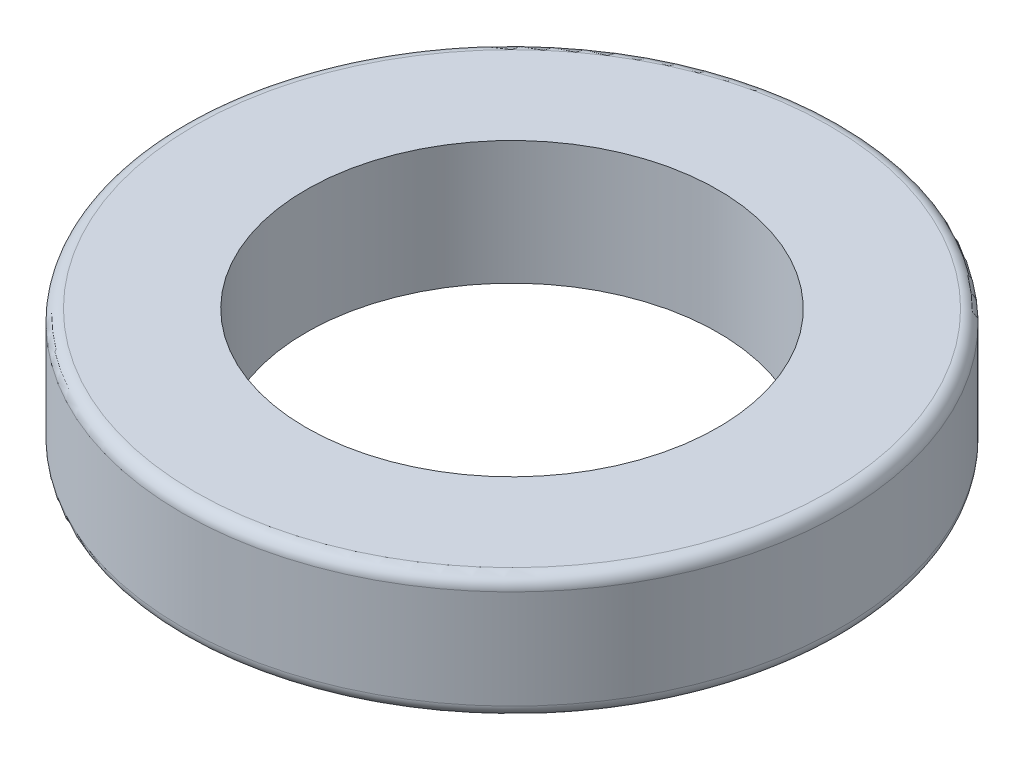
ISO-10303-21;
HEADER;
FILE_DESCRIPTION(('STEP AP214'),'2;1');
FILE_NAME('part.step','',(''),(''),'','','');
FILE_SCHEMA(('AUTOMOTIVE_DESIGN { 1 0 10303 214 1 1 1 1 }'));
ENDSEC;
DATA;
#1=APPLICATION_CONTEXT('core data for automotive mechanical design processes');
#2=APPLICATION_PROTOCOL_DEFINITION('international standard','automotive_design',2000,#1);
#3=PRODUCT_CONTEXT('',#1,'mechanical');
#4=PRODUCT('Part','Part','',(#3));
#5=PRODUCT_RELATED_PRODUCT_CATEGORY('part','',(#4));
#6=PRODUCT_DEFINITION_FORMATION('','',#4);
#7=PRODUCT_DEFINITION_CONTEXT('part definition',#1,'design');
#8=PRODUCT_DEFINITION('design','',#6,#7);
#9=PRODUCT_DEFINITION_SHAPE('','',#8);
#10=(LENGTH_UNIT() NAMED_UNIT(*) SI_UNIT(.MILLI.,.METRE.));
#11=(NAMED_UNIT(*) PLANE_ANGLE_UNIT() SI_UNIT($,.RADIAN.));
#12=(NAMED_UNIT(*) SI_UNIT($,.STERADIAN.) SOLID_ANGLE_UNIT());
#13=UNCERTAINTY_MEASURE_WITH_UNIT(LENGTH_MEASURE(1.E-05),#10,'distance_accuracy_value','');
#14=(GEOMETRIC_REPRESENTATION_CONTEXT(3) GLOBAL_UNCERTAINTY_ASSIGNED_CONTEXT((#13)) GLOBAL_UNIT_ASSIGNED_CONTEXT((#10,
#11,#12)) REPRESENTATION_CONTEXT('',''));
#15=CARTESIAN_POINT('',(0.,0.,0.));
#16=DIRECTION('',(0.,0.,1.));
#17=DIRECTION('',(1.,0.,0.));
#18=AXIS2_PLACEMENT_3D('',#15,#16,#17);
#19=CARTESIAN_POINT('',(0.,3.,0.));
#20=DIRECTION('',(0.,1.,0.));
#21=DIRECTION('',(0.,0.,1.));
#22=AXIS2_PLACEMENT_3D('',#19,#20,#21);
#23=PLANE('',#22);
#24=CARTESIAN_POINT('',(0.,3.,0.));
#25=DIRECTION('',(0.,1.,0.));
#26=DIRECTION('',(0.,0.,1.));
#27=AXIS2_PLACEMENT_3D('',#24,#25,#26);
#28=CIRCLE('',#27,7.7);
#29=CARTESIAN_POINT('',(0.,3.,7.7));
#30=VERTEX_POINT('',#29);
#31=EDGE_CURVE('E10',#30,#30,#28,.T.);
#32=ORIENTED_EDGE('',*,*,#31,.T.);
#33=EDGE_LOOP('',(#32));
#34=FACE_BOUND('',#33,.T.);
#35=CARTESIAN_POINT('',(0.,3.,0.));
#36=DIRECTION('',(0.,1.,0.));
#37=DIRECTION('',(0.,0.,1.));
#38=AXIS2_PLACEMENT_3D('',#35,#36,#37);
#39=CIRCLE('',#38,5.);
#40=CARTESIAN_POINT('',(0.,3.,5.));
#41=VERTEX_POINT('',#40);
#42=EDGE_CURVE('E61',#41,#41,#39,.T.);
#43=ORIENTED_EDGE('',*,*,#42,.F.);
#44=EDGE_LOOP('',(#43));
#45=FACE_BOUND('',#44,.T.);
#46=ADVANCED_FACE('F37',(#34,#45),#23,.T.);
#47=CARTESIAN_POINT('',(0.,0.,0.));
#48=DIRECTION('',(0.,1.,0.));
#49=DIRECTION('',(0.,0.,1.));
#50=AXIS2_PLACEMENT_3D('',#47,#48,#49);
#51=PLANE('',#50);
#52=CARTESIAN_POINT('',(0.,0.,0.));
#53=DIRECTION('',(0.,1.,0.));
#54=DIRECTION('',(0.,0.,1.));
#55=AXIS2_PLACEMENT_3D('',#52,#53,#54);
#56=CIRCLE('',#55,7.7);
#57=CARTESIAN_POINT('',(0.,0.,7.7));
#58=VERTEX_POINT('',#57);
#59=EDGE_CURVE('E45',#58,#58,#56,.F.);
#60=ORIENTED_EDGE('',*,*,#59,.T.);
#61=EDGE_LOOP('',(#60));
#62=FACE_BOUND('',#61,.T.);
#63=CARTESIAN_POINT('',(0.,0.,0.));
#64=DIRECTION('',(0.,1.,0.));
#65=DIRECTION('',(0.,0.,1.));
#66=AXIS2_PLACEMENT_3D('',#63,#64,#65);
#67=CIRCLE('',#66,5.);
#68=CARTESIAN_POINT('',(0.,0.,5.));
#69=VERTEX_POINT('',#68);
#70=EDGE_CURVE('E62',#69,#69,#67,.T.);
#71=ORIENTED_EDGE('',*,*,#70,.T.);
#72=EDGE_LOOP('',(#71));
#73=FACE_BOUND('',#72,.T.);
#74=ADVANCED_FACE('F74',(#62,#73),#51,.F.);
#75=CARTESIAN_POINT('',(0.,3.,0.));
#76=DIRECTION('',(0.,-1.,0.));
#77=DIRECTION('',(0.,0.,-1.));
#78=AXIS2_PLACEMENT_3D('',#75,#76,#77);
#79=CYLINDRICAL_SURFACE('',#78,8.);
#80=CARTESIAN_POINT('',(0.,0.3,0.));
#81=DIRECTION('',(0.,1.,0.));
#82=DIRECTION('',(0.,0.,1.));
#83=AXIS2_PLACEMENT_3D('',#80,#81,#82);
#84=CIRCLE('',#83,8.);
#85=CARTESIAN_POINT('',(0.,0.3,8.));
#86=VERTEX_POINT('',#85);
#87=EDGE_CURVE('E50',#86,#86,#84,.T.);
#88=ORIENTED_EDGE('',*,*,#87,.T.);
#89=EDGE_LOOP('',(#88));
#90=FACE_BOUND('',#89,.T.);
#91=CARTESIAN_POINT('',(0.,2.7,0.));
#92=DIRECTION('',(0.,1.,0.));
#93=DIRECTION('',(0.,0.,1.));
#94=AXIS2_PLACEMENT_3D('',#91,#92,#93);
#95=CIRCLE('',#94,8.);
#96=CARTESIAN_POINT('',(0.,2.7,8.));
#97=VERTEX_POINT('',#96);
#98=EDGE_CURVE('E55',#97,#97,#95,.F.);
#99=ORIENTED_EDGE('',*,*,#98,.T.);
#100=EDGE_LOOP('',(#99));
#101=FACE_BOUND('',#100,.T.);
#102=ADVANCED_FACE('F79',(#90,#101),#79,.T.);
#103=CARTESIAN_POINT('',(0.,3.,0.));
#104=DIRECTION('',(0.,-1.,0.));
#105=DIRECTION('',(0.,0.,-1.));
#106=AXIS2_PLACEMENT_3D('',#103,#104,#105);
#107=CYLINDRICAL_SURFACE('',#106,5.);
#108=ORIENTED_EDGE('',*,*,#42,.T.);
#109=EDGE_LOOP('',(#108));
#110=FACE_BOUND('',#109,.T.);
#111=ORIENTED_EDGE('',*,*,#70,.F.);
#112=EDGE_LOOP('',(#111));
#113=FACE_BOUND('',#112,.T.);
#114=ADVANCED_FACE('F70',(#110,#113),#107,.F.);
#115=CARTESIAN_POINT('',(0.,0.3,0.));
#116=DIRECTION('',(0.,1.,0.));
#117=DIRECTION('',(0.,0.,1.));
#118=AXIS2_PLACEMENT_3D('',#115,#116,#117);
#119=TOROIDAL_SURFACE('',#118,7.7,0.3);
#120=ORIENTED_EDGE('',*,*,#59,.F.);
#121=EDGE_LOOP('',(#120));
#122=FACE_BOUND('',#121,.T.);
#123=ORIENTED_EDGE('',*,*,#87,.F.);
#124=EDGE_LOOP('',(#123));
#125=FACE_BOUND('',#124,.T.);
#126=ADVANCED_FACE('F85',(#122,#125),#119,.T.);
#127=CARTESIAN_POINT('',(0.,2.7,0.));
#128=DIRECTION('',(0.,1.,0.));
#129=DIRECTION('',(0.,0.,1.));
#130=AXIS2_PLACEMENT_3D('',#127,#128,#129);
#131=TOROIDAL_SURFACE('',#130,7.7,0.3);
#132=ORIENTED_EDGE('',*,*,#98,.F.);
#133=EDGE_LOOP('',(#132));
#134=FACE_BOUND('',#133,.T.);
#135=ORIENTED_EDGE('',*,*,#31,.F.);
#136=EDGE_LOOP('',(#135));
#137=FACE_BOUND('',#136,.T.);
#138=ADVANCED_FACE('F39',(#134,#137),#131,.T.);
#139=CLOSED_SHELL('',(#46,#74,#102,#114,#126,#138));
#140=MANIFOLD_SOLID_BREP('B2',#139);
#141=ADVANCED_BREP_SHAPE_REPRESENTATION('',(#18,#140),#14);
#142=SHAPE_DEFINITION_REPRESENTATION(#9,#141);
ENDSEC;
END-ISO-10303-21;
